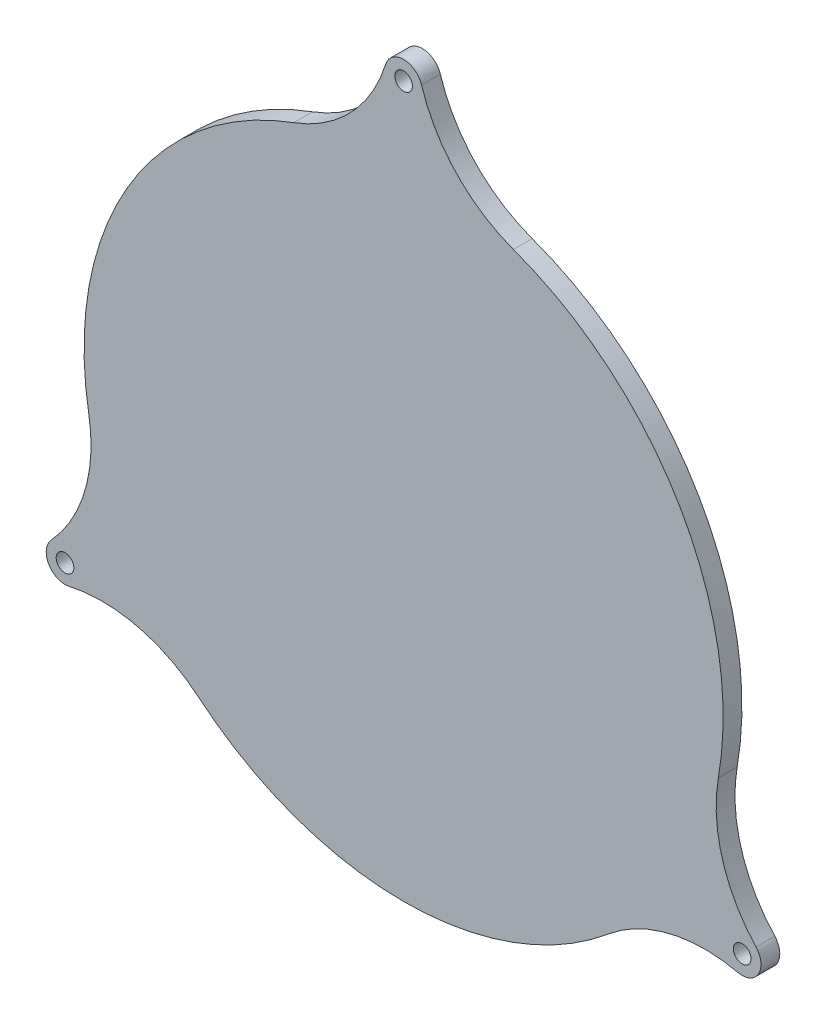
ISO-10303-21;
HEADER;
FILE_DESCRIPTION(('STEP AP214'),'2;1');
FILE_NAME('part.step','',(''),(''),'','','');
FILE_SCHEMA(('AUTOMOTIVE_DESIGN { 1 0 10303 214 1 1 1 1 }'));
ENDSEC;
DATA;
#1=APPLICATION_CONTEXT('core data for automotive mechanical design processes');
#2=APPLICATION_PROTOCOL_DEFINITION('international standard','automotive_design',2000,#1);
#3=PRODUCT_CONTEXT('',#1,'mechanical');
#4=PRODUCT('Part','Part','',(#3));
#5=PRODUCT_RELATED_PRODUCT_CATEGORY('part','',(#4));
#6=PRODUCT_DEFINITION_FORMATION('','',#4);
#7=PRODUCT_DEFINITION_CONTEXT('part definition',#1,'design');
#8=PRODUCT_DEFINITION('design','',#6,#7);
#9=PRODUCT_DEFINITION_SHAPE('','',#8);
#10=(LENGTH_UNIT() NAMED_UNIT(*) SI_UNIT(.MILLI.,.METRE.));
#11=(NAMED_UNIT(*) PLANE_ANGLE_UNIT() SI_UNIT($,.RADIAN.));
#12=(NAMED_UNIT(*) SI_UNIT($,.STERADIAN.) SOLID_ANGLE_UNIT());
#13=UNCERTAINTY_MEASURE_WITH_UNIT(LENGTH_MEASURE(1.E-05),#10,'distance_accuracy_value','');
#14=(GEOMETRIC_REPRESENTATION_CONTEXT(3) GLOBAL_UNCERTAINTY_ASSIGNED_CONTEXT((#13)) GLOBAL_UNIT_ASSIGNED_CONTEXT((#10,
#11,#12)) REPRESENTATION_CONTEXT('',''));
#15=CARTESIAN_POINT('',(0.,0.,0.));
#16=DIRECTION('',(0.,0.,1.));
#17=DIRECTION('',(1.,0.,0.));
#18=AXIS2_PLACEMENT_3D('',#15,#16,#17);
#19=CARTESIAN_POINT('',(21.4816902908379,58.6923076923077,5.));
#20=DIRECTION('',(0.,0.,1.));
#21=DIRECTION('',(1.,0.,0.));
#22=AXIS2_PLACEMENT_3D('',#19,#20,#21);
#23=PLANE('',#22);
#24=CARTESIAN_POINT('',(90.0666419935817,-52.,5.));
#25=DIRECTION('',(0.,0.,1.));
#26=DIRECTION('',(1.,0.,0.));
#27=AXIS2_PLACEMENT_3D('',#24,#25,#26);
#28=CIRCLE('',#27,2.35);
#29=CARTESIAN_POINT('',(92.4166419935816,-52.,5.));
#30=VERTEX_POINT('',#29);
#31=EDGE_CURVE('E287',#30,#30,#28,.T.);
#32=ORIENTED_EDGE('',*,*,#31,.F.);
#33=EDGE_LOOP('',(#32));
#34=FACE_BOUND('',#33,.T.);
#35=CARTESIAN_POINT('',(42.9633805816758,117.384615384615,5.));
#36=DIRECTION('',(0.,0.,-1.));
#37=DIRECTION('',(1.,0.,0.));
#38=AXIS2_PLACEMENT_3D('',#35,#36,#37);
#39=CIRCLE('',#38,40.);
#40=CARTESIAN_POINT('',(29.2150987955395,79.8215384615384,5.));
#41=VERTEX_POINT('',#40);
#42=CARTESIAN_POINT('',(4.77370895351953,105.487179487179,5.));
#43=VERTEX_POINT('',#42);
#44=EDGE_CURVE('E178',#41,#43,#39,.T.);
#45=ORIENTED_EDGE('',*,*,#44,.T.);
#46=CARTESIAN_POINT('',(0.,104.,5.));
#47=DIRECTION('',(0.,0.,1.));
#48=DIRECTION('',(1.,0.,0.));
#49=AXIS2_PLACEMENT_3D('',#46,#47,#48);
#50=CIRCLE('',#49,5.);
#51=CARTESIAN_POINT('',(-4.77370895351953,105.487179487179,5.));
#52=VERTEX_POINT('',#51);
#53=EDGE_CURVE('E106',#43,#52,#50,.T.);
#54=ORIENTED_EDGE('',*,*,#53,.T.);
#55=CARTESIAN_POINT('',(-42.9633805816758,117.384615384615,5.));
#56=DIRECTION('',(0.,0.,-1.));
#57=DIRECTION('',(-1.,0.,0.));
#58=AXIS2_PLACEMENT_3D('',#55,#56,#57);
#59=CIRCLE('',#58,40.);
#60=CARTESIAN_POINT('',(-29.2150987955395,79.8215384615385,5.));
#61=VERTEX_POINT('',#60);
#62=EDGE_CURVE('E205',#52,#61,#59,.T.);
#63=ORIENTED_EDGE('',*,*,#62,.T.);
#64=CARTESIAN_POINT('',(0.,0.,5.));
#65=DIRECTION('',(0.,0.,1.));
#66=DIRECTION('',(1.,0.,0.));
#67=AXIS2_PLACEMENT_3D('',#64,#65,#66);
#68=CIRCLE('',#67,85.);
#69=CARTESIAN_POINT('',(-83.7350294746187,-14.6097514997598,5.));
#70=VERTEX_POINT('',#69);
#71=EDGE_CURVE('E224',#61,#70,#68,.T.);
#72=ORIENTED_EDGE('',*,*,#71,.T.);
#73=CARTESIAN_POINT('',(-123.13974922738,-21.4849286761175,5.));
#74=DIRECTION('',(0.,0.,-1.));
#75=DIRECTION('',(1.,0.,0.));
#76=AXIS2_PLACEMENT_3D('',#73,#74,#75);
#77=CIRCLE('',#76,40.);
#78=CARTESIAN_POINT('',(-93.7414316862259,-48.6094365195686,5.));
#79=VERTEX_POINT('',#78);
#80=EDGE_CURVE('E221',#70,#79,#77,.T.);
#81=ORIENTED_EDGE('',*,*,#80,.T.);
#82=CARTESIAN_POINT('',(-90.0666419935816,-52.,5.));
#83=DIRECTION('',(0.,0.,1.));
#84=DIRECTION('',(1.,0.,0.));
#85=AXIS2_PLACEMENT_3D('',#82,#83,#84);
#86=CIRCLE('',#85,4.99999999999999);
#87=CARTESIAN_POINT('',(-88.9677227327064,-56.8777429676109,5.));
#88=VERTEX_POINT('',#87);
#89=EDGE_CURVE('E223',#79,#88,#86,.T.);
#90=ORIENTED_EDGE('',*,*,#89,.T.);
#91=CARTESIAN_POINT('',(-80.1763686457046,-95.899686708498,5.));
#92=DIRECTION('',(0.,0.,-1.));
#93=DIRECTION('',(-1.,0.,0.));
#94=AXIS2_PLACEMENT_3D('',#91,#92,#93);
#95=CIRCLE('',#94,40.);
#96=CARTESIAN_POINT('',(-54.5199306790791,-65.2117869617787,5.));
#97=VERTEX_POINT('',#96);
#98=EDGE_CURVE('E226',#88,#97,#95,.T.);
#99=ORIENTED_EDGE('',*,*,#98,.T.);
#100=CARTESIAN_POINT('',(0.,0.,5.));
#101=DIRECTION('',(0.,0.,1.));
#102=DIRECTION('',(1.,0.,0.));
#103=AXIS2_PLACEMENT_3D('',#100,#101,#102);
#104=CIRCLE('',#103,85.);
#105=CARTESIAN_POINT('',(54.5199306790791,-65.2117869617787,5.));
#106=VERTEX_POINT('',#105);
#107=EDGE_CURVE('E232',#97,#106,#104,.T.);
#108=ORIENTED_EDGE('',*,*,#107,.T.);
#109=CARTESIAN_POINT('',(80.1763686457047,-95.899686708498,5.));
#110=DIRECTION('',(0.,0.,-1.));
#111=DIRECTION('',(1.,0.,0.));
#112=AXIS2_PLACEMENT_3D('',#109,#110,#111);
#113=CIRCLE('',#112,40.);
#114=CARTESIAN_POINT('',(88.9677227327064,-56.8777429676109,5.));
#115=VERTEX_POINT('',#114);
#116=EDGE_CURVE('E137',#106,#115,#113,.T.);
#117=ORIENTED_EDGE('',*,*,#116,.T.);
#118=CARTESIAN_POINT('',(90.0666419935817,-52.,5.));
#119=DIRECTION('',(0.,0.,1.));
#120=DIRECTION('',(1.,0.,0.));
#121=AXIS2_PLACEMENT_3D('',#118,#119,#120);
#122=CIRCLE('',#121,4.99999999999998);
#123=CARTESIAN_POINT('',(93.7414316862259,-48.6094365195686,5.));
#124=VERTEX_POINT('',#123);
#125=EDGE_CURVE('E131',#115,#124,#122,.T.);
#126=ORIENTED_EDGE('',*,*,#125,.T.);
#127=CARTESIAN_POINT('',(123.13974922738,-21.4849286761174,5.));
#128=DIRECTION('',(0.,0.,-1.));
#129=DIRECTION('',(-1.,0.,0.));
#130=AXIS2_PLACEMENT_3D('',#127,#128,#129);
#131=CIRCLE('',#130,40.);
#132=CARTESIAN_POINT('',(83.7350294746187,-14.6097514997598,5.));
#133=VERTEX_POINT('',#132);
#134=EDGE_CURVE('E135',#124,#133,#131,.T.);
#135=ORIENTED_EDGE('',*,*,#134,.T.);
#136=CARTESIAN_POINT('',(0.,0.,5.));
#137=DIRECTION('',(0.,0.,1.));
#138=DIRECTION('',(1.,0.,0.));
#139=AXIS2_PLACEMENT_3D('',#136,#137,#138);
#140=CIRCLE('',#139,85.);
#141=EDGE_CURVE('E51',#133,#41,#140,.T.);
#142=ORIENTED_EDGE('',*,*,#141,.T.);
#143=EDGE_LOOP('',(#45,#54,#63,#72,#81,#90,#99,#108,#117,#126,#135,#142));
#144=FACE_BOUND('',#143,.T.);
#145=CARTESIAN_POINT('',(0.,104.,5.));
#146=DIRECTION('',(0.,0.,1.));
#147=DIRECTION('',(1.,0.,0.));
#148=AXIS2_PLACEMENT_3D('',#145,#146,#147);
#149=CIRCLE('',#148,2.35);
#150=CARTESIAN_POINT('',(2.35,104.,5.));
#151=VERTEX_POINT('',#150);
#152=EDGE_CURVE('E159',#151,#151,#149,.T.);
#153=ORIENTED_EDGE('',*,*,#152,.F.);
#154=EDGE_LOOP('',(#153));
#155=FACE_BOUND('',#154,.T.);
#156=CARTESIAN_POINT('',(-90.0666419935816,-52.,5.));
#157=DIRECTION('',(0.,0.,1.));
#158=DIRECTION('',(1.,0.,0.));
#159=AXIS2_PLACEMENT_3D('',#156,#157,#158);
#160=CIRCLE('',#159,2.35);
#161=CARTESIAN_POINT('',(-87.7166419935816,-52.,5.));
#162=VERTEX_POINT('',#161);
#163=EDGE_CURVE('E278',#162,#162,#160,.T.);
#164=ORIENTED_EDGE('',*,*,#163,.F.);
#165=EDGE_LOOP('',(#164));
#166=FACE_BOUND('',#165,.T.);
#167=ADVANCED_FACE('F34',(#34,#144,#155,#166),#23,.T.);
#168=CARTESIAN_POINT('',(21.4816902908379,58.6923076923077,0.));
#169=DIRECTION('',(0.,0.,1.));
#170=DIRECTION('',(1.,0.,0.));
#171=AXIS2_PLACEMENT_3D('',#168,#169,#170);
#172=PLANE('',#171);
#173=CARTESIAN_POINT('',(42.9633805816758,117.384615384615,0.));
#174=DIRECTION('',(0.,0.,-1.));
#175=DIRECTION('',(1.,0.,0.));
#176=AXIS2_PLACEMENT_3D('',#173,#174,#175);
#177=CIRCLE('',#176,40.);
#178=CARTESIAN_POINT('',(29.2150987955395,79.8215384615384,0.));
#179=VERTEX_POINT('',#178);
#180=CARTESIAN_POINT('',(4.77370895351953,105.487179487179,0.));
#181=VERTEX_POINT('',#180);
#182=EDGE_CURVE('E155',#179,#181,#177,.T.);
#183=ORIENTED_EDGE('',*,*,#182,.F.);
#184=CARTESIAN_POINT('',(0.,0.,0.));
#185=DIRECTION('',(0.,0.,1.));
#186=DIRECTION('',(1.,0.,0.));
#187=AXIS2_PLACEMENT_3D('',#184,#185,#186);
#188=CIRCLE('',#187,85.);
#189=CARTESIAN_POINT('',(83.7350294746187,-14.6097514997598,0.));
#190=VERTEX_POINT('',#189);
#191=EDGE_CURVE('E98',#190,#179,#188,.T.);
#192=ORIENTED_EDGE('',*,*,#191,.F.);
#193=CARTESIAN_POINT('',(123.13974922738,-21.4849286761174,0.));
#194=DIRECTION('',(0.,0.,-1.));
#195=DIRECTION('',(-1.,0.,0.));
#196=AXIS2_PLACEMENT_3D('',#193,#194,#195);
#197=CIRCLE('',#196,40.);
#198=CARTESIAN_POINT('',(93.7414316862259,-48.6094365195686,0.));
#199=VERTEX_POINT('',#198);
#200=EDGE_CURVE('E92',#199,#190,#197,.T.);
#201=ORIENTED_EDGE('',*,*,#200,.F.);
#202=CARTESIAN_POINT('',(90.0666419935817,-52.,0.));
#203=DIRECTION('',(0.,0.,1.));
#204=DIRECTION('',(1.,0.,0.));
#205=AXIS2_PLACEMENT_3D('',#202,#203,#204);
#206=CIRCLE('',#205,4.99999999999998);
#207=CARTESIAN_POINT('',(88.9677227327064,-56.8777429676109,0.));
#208=VERTEX_POINT('',#207);
#209=EDGE_CURVE('E145',#208,#199,#206,.T.);
#210=ORIENTED_EDGE('',*,*,#209,.F.);
#211=CARTESIAN_POINT('',(80.1763686457047,-95.899686708498,0.));
#212=DIRECTION('',(0.,0.,-1.));
#213=DIRECTION('',(1.,0.,0.));
#214=AXIS2_PLACEMENT_3D('',#211,#212,#213);
#215=CIRCLE('',#214,40.);
#216=CARTESIAN_POINT('',(54.5199306790791,-65.2117869617787,0.));
#217=VERTEX_POINT('',#216);
#218=EDGE_CURVE('E173',#217,#208,#215,.T.);
#219=ORIENTED_EDGE('',*,*,#218,.F.);
#220=CARTESIAN_POINT('',(0.,0.,0.));
#221=DIRECTION('',(0.,0.,1.));
#222=DIRECTION('',(1.,0.,0.));
#223=AXIS2_PLACEMENT_3D('',#220,#221,#222);
#224=CIRCLE('',#223,85.);
#225=CARTESIAN_POINT('',(-54.5199306790791,-65.2117869617787,0.));
#226=VERTEX_POINT('',#225);
#227=EDGE_CURVE('E171',#226,#217,#224,.T.);
#228=ORIENTED_EDGE('',*,*,#227,.F.);
#229=CARTESIAN_POINT('',(-80.1763686457046,-95.899686708498,0.));
#230=DIRECTION('',(0.,0.,-1.));
#231=DIRECTION('',(-1.,0.,0.));
#232=AXIS2_PLACEMENT_3D('',#229,#230,#231);
#233=CIRCLE('',#232,40.);
#234=CARTESIAN_POINT('',(-88.9677227327064,-56.8777429676109,0.));
#235=VERTEX_POINT('',#234);
#236=EDGE_CURVE('E169',#235,#226,#233,.T.);
#237=ORIENTED_EDGE('',*,*,#236,.F.);
#238=CARTESIAN_POINT('',(-90.0666419935816,-52.,0.));
#239=DIRECTION('',(0.,0.,1.));
#240=DIRECTION('',(1.,0.,0.));
#241=AXIS2_PLACEMENT_3D('',#238,#239,#240);
#242=CIRCLE('',#241,4.99999999999999);
#243=CARTESIAN_POINT('',(-93.7414316862259,-48.6094365195686,0.));
#244=VERTEX_POINT('',#243);
#245=EDGE_CURVE('E167',#244,#235,#242,.T.);
#246=ORIENTED_EDGE('',*,*,#245,.F.);
#247=CARTESIAN_POINT('',(-123.13974922738,-21.4849286761175,0.));
#248=DIRECTION('',(0.,0.,-1.));
#249=DIRECTION('',(1.,0.,0.));
#250=AXIS2_PLACEMENT_3D('',#247,#248,#249);
#251=CIRCLE('',#250,40.);
#252=CARTESIAN_POINT('',(-83.7350294746187,-14.6097514997598,0.));
#253=VERTEX_POINT('',#252);
#254=EDGE_CURVE('E165',#253,#244,#251,.T.);
#255=ORIENTED_EDGE('',*,*,#254,.F.);
#256=CARTESIAN_POINT('',(0.,0.,0.));
#257=DIRECTION('',(0.,0.,1.));
#258=DIRECTION('',(1.,0.,0.));
#259=AXIS2_PLACEMENT_3D('',#256,#257,#258);
#260=CIRCLE('',#259,85.);
#261=CARTESIAN_POINT('',(-29.2150987955395,79.8215384615385,0.));
#262=VERTEX_POINT('',#261);
#263=EDGE_CURVE('E163',#262,#253,#260,.T.);
#264=ORIENTED_EDGE('',*,*,#263,.F.);
#265=CARTESIAN_POINT('',(-42.9633805816758,117.384615384615,0.));
#266=DIRECTION('',(0.,0.,-1.));
#267=DIRECTION('',(-1.,0.,0.));
#268=AXIS2_PLACEMENT_3D('',#265,#266,#267);
#269=CIRCLE('',#268,40.);
#270=CARTESIAN_POINT('',(-4.77370895351953,105.487179487179,0.));
#271=VERTEX_POINT('',#270);
#272=EDGE_CURVE('E161',#271,#262,#269,.T.);
#273=ORIENTED_EDGE('',*,*,#272,.F.);
#274=CARTESIAN_POINT('',(0.,104.,0.));
#275=DIRECTION('',(0.,0.,1.));
#276=DIRECTION('',(1.,0.,0.));
#277=AXIS2_PLACEMENT_3D('',#274,#275,#276);
#278=CIRCLE('',#277,5.);
#279=EDGE_CURVE('E158',#181,#271,#278,.T.);
#280=ORIENTED_EDGE('',*,*,#279,.F.);
#281=EDGE_LOOP('',(#183,#192,#201,#210,#219,#228,#237,#246,#255,#264,#273,#280));
#282=FACE_BOUND('',#281,.T.);
#283=CARTESIAN_POINT('',(0.,104.,0.));
#284=DIRECTION('',(0.,0.,1.));
#285=DIRECTION('',(1.,0.,0.));
#286=AXIS2_PLACEMENT_3D('',#283,#284,#285);
#287=CIRCLE('',#286,2.35);
#288=CARTESIAN_POINT('',(2.35,104.,0.));
#289=VERTEX_POINT('',#288);
#290=EDGE_CURVE('E290',#289,#289,#287,.T.);
#291=ORIENTED_EDGE('',*,*,#290,.T.);
#292=EDGE_LOOP('',(#291));
#293=FACE_BOUND('',#292,.T.);
#294=CARTESIAN_POINT('',(90.0666419935817,-52.,0.));
#295=DIRECTION('',(0.,0.,1.));
#296=DIRECTION('',(1.,0.,0.));
#297=AXIS2_PLACEMENT_3D('',#294,#295,#296);
#298=CIRCLE('',#297,2.35);
#299=CARTESIAN_POINT('',(92.4166419935816,-52.,0.));
#300=VERTEX_POINT('',#299);
#301=EDGE_CURVE('E284',#300,#300,#298,.T.);
#302=ORIENTED_EDGE('',*,*,#301,.T.);
#303=EDGE_LOOP('',(#302));
#304=FACE_BOUND('',#303,.T.);
#305=CARTESIAN_POINT('',(-90.0666419935816,-52.,0.));
#306=DIRECTION('',(0.,0.,1.));
#307=DIRECTION('',(1.,0.,0.));
#308=AXIS2_PLACEMENT_3D('',#305,#306,#307);
#309=CIRCLE('',#308,2.35);
#310=CARTESIAN_POINT('',(-87.7166419935816,-52.,0.));
#311=VERTEX_POINT('',#310);
#312=EDGE_CURVE('E281',#311,#311,#309,.T.);
#313=ORIENTED_EDGE('',*,*,#312,.T.);
#314=EDGE_LOOP('',(#313));
#315=FACE_BOUND('',#314,.T.);
#316=ADVANCED_FACE('F209',(#282,#293,#304,#315),#172,.F.);
#317=CARTESIAN_POINT('',(42.9633805816758,117.384615384615,5.));
#318=DIRECTION('',(0.,0.,-1.));
#319=DIRECTION('',(-1.,0.,0.));
#320=AXIS2_PLACEMENT_3D('',#317,#318,#319);
#321=CYLINDRICAL_SURFACE('',#320,40.);
#322=ORIENTED_EDGE('',*,*,#182,.T.);
#323=DIRECTION('',(0.,0.,-1.));
#324=VECTOR('',#323,1.);
#325=CARTESIAN_POINT('',(4.77370895351953,105.487179487179,5.));
#326=LINE('',#325,#324);
#327=EDGE_CURVE('E11',#43,#181,#326,.T.);
#328=ORIENTED_EDGE('',*,*,#327,.F.);
#329=ORIENTED_EDGE('',*,*,#44,.F.);
#330=DIRECTION('',(0.,0.,-1.));
#331=VECTOR('',#330,1.);
#332=CARTESIAN_POINT('',(29.2150987955395,79.8215384615384,5.));
#333=LINE('',#332,#331);
#334=EDGE_CURVE('E151',#41,#179,#333,.T.);
#335=ORIENTED_EDGE('',*,*,#334,.T.);
#336=EDGE_LOOP('',(#322,#328,#329,#335));
#337=FACE_BOUND('',#336,.T.);
#338=ADVANCED_FACE('F36',(#337),#321,.F.);
#339=CARTESIAN_POINT('',(0.,104.,5.));
#340=DIRECTION('',(0.,0.,-1.));
#341=DIRECTION('',(-1.,0.,0.));
#342=AXIS2_PLACEMENT_3D('',#339,#340,#341);
#343=CYLINDRICAL_SURFACE('',#342,5.);
#344=ORIENTED_EDGE('',*,*,#279,.T.);
#345=DIRECTION('',(0.,0.,-1.));
#346=VECTOR('',#345,1.);
#347=CARTESIAN_POINT('',(-4.77370895351953,105.487179487179,5.));
#348=LINE('',#347,#346);
#349=EDGE_CURVE('E43',#52,#271,#348,.T.);
#350=ORIENTED_EDGE('',*,*,#349,.F.);
#351=ORIENTED_EDGE('',*,*,#53,.F.);
#352=ORIENTED_EDGE('',*,*,#327,.T.);
#353=EDGE_LOOP('',(#344,#350,#351,#352));
#354=FACE_BOUND('',#353,.T.);
#355=ADVANCED_FACE('F392',(#354),#343,.T.);
#356=CARTESIAN_POINT('',(-42.9633805816758,117.384615384615,5.));
#357=DIRECTION('',(0.,0.,-1.));
#358=DIRECTION('',(-1.,0.,0.));
#359=AXIS2_PLACEMENT_3D('',#356,#357,#358);
#360=CYLINDRICAL_SURFACE('',#359,40.);
#361=ORIENTED_EDGE('',*,*,#272,.T.);
#362=DIRECTION('',(0.,0.,-1.));
#363=VECTOR('',#362,1.);
#364=CARTESIAN_POINT('',(-29.2150987955395,79.8215384615385,5.));
#365=LINE('',#364,#363);
#366=EDGE_CURVE('E197',#61,#262,#365,.T.);
#367=ORIENTED_EDGE('',*,*,#366,.F.);
#368=ORIENTED_EDGE('',*,*,#62,.F.);
#369=ORIENTED_EDGE('',*,*,#349,.T.);
#370=EDGE_LOOP('',(#361,#367,#368,#369));
#371=FACE_BOUND('',#370,.T.);
#372=ADVANCED_FACE('F203',(#371),#360,.F.);
#373=CARTESIAN_POINT('',(0.,0.,5.));
#374=DIRECTION('',(0.,0.,-1.));
#375=DIRECTION('',(-1.,0.,0.));
#376=AXIS2_PLACEMENT_3D('',#373,#374,#375);
#377=CYLINDRICAL_SURFACE('',#376,85.);
#378=ORIENTED_EDGE('',*,*,#263,.T.);
#379=DIRECTION('',(0.,0.,-1.));
#380=VECTOR('',#379,1.);
#381=CARTESIAN_POINT('',(-83.7350294746187,-14.6097514997598,5.));
#382=LINE('',#381,#380);
#383=EDGE_CURVE('E194',#70,#253,#382,.T.);
#384=ORIENTED_EDGE('',*,*,#383,.F.);
#385=ORIENTED_EDGE('',*,*,#71,.F.);
#386=ORIENTED_EDGE('',*,*,#366,.T.);
#387=EDGE_LOOP('',(#378,#384,#385,#386));
#388=FACE_BOUND('',#387,.T.);
#389=ADVANCED_FACE('F215',(#388),#377,.T.);
#390=CARTESIAN_POINT('',(-123.13974922738,-21.4849286761175,5.));
#391=DIRECTION('',(0.,0.,-1.));
#392=DIRECTION('',(-1.,0.,0.));
#393=AXIS2_PLACEMENT_3D('',#390,#391,#392);
#394=CYLINDRICAL_SURFACE('',#393,40.);
#395=ORIENTED_EDGE('',*,*,#254,.T.);
#396=DIRECTION('',(0.,0.,-1.));
#397=VECTOR('',#396,1.);
#398=CARTESIAN_POINT('',(-93.7414316862259,-48.6094365195686,5.));
#399=LINE('',#398,#397);
#400=EDGE_CURVE('E191',#79,#244,#399,.T.);
#401=ORIENTED_EDGE('',*,*,#400,.F.);
#402=ORIENTED_EDGE('',*,*,#80,.F.);
#403=ORIENTED_EDGE('',*,*,#383,.T.);
#404=EDGE_LOOP('',(#395,#401,#402,#403));
#405=FACE_BOUND('',#404,.T.);
#406=ADVANCED_FACE('F219',(#405),#394,.F.);
#407=CARTESIAN_POINT('',(-90.0666419935816,-52.,5.));
#408=DIRECTION('',(0.,0.,-1.));
#409=DIRECTION('',(-1.,0.,0.));
#410=AXIS2_PLACEMENT_3D('',#407,#408,#409);
#411=CYLINDRICAL_SURFACE('',#410,4.99999999999999);
#412=ORIENTED_EDGE('',*,*,#245,.T.);
#413=DIRECTION('',(0.,0.,-1.));
#414=VECTOR('',#413,1.);
#415=CARTESIAN_POINT('',(-88.9677227327064,-56.8777429676109,5.));
#416=LINE('',#415,#414);
#417=EDGE_CURVE('E188',#88,#235,#416,.T.);
#418=ORIENTED_EDGE('',*,*,#417,.F.);
#419=ORIENTED_EDGE('',*,*,#89,.F.);
#420=ORIENTED_EDGE('',*,*,#400,.T.);
#421=EDGE_LOOP('',(#412,#418,#419,#420));
#422=FACE_BOUND('',#421,.T.);
#423=ADVANCED_FACE('F357',(#422),#411,.T.);
#424=CARTESIAN_POINT('',(-80.1763686457046,-95.899686708498,5.));
#425=DIRECTION('',(0.,0.,-1.));
#426=DIRECTION('',(-1.,0.,0.));
#427=AXIS2_PLACEMENT_3D('',#424,#425,#426);
#428=CYLINDRICAL_SURFACE('',#427,40.);
#429=ORIENTED_EDGE('',*,*,#236,.T.);
#430=DIRECTION('',(0.,0.,-1.));
#431=VECTOR('',#430,1.);
#432=CARTESIAN_POINT('',(-54.5199306790791,-65.2117869617787,5.));
#433=LINE('',#432,#431);
#434=EDGE_CURVE('E185',#97,#226,#433,.T.);
#435=ORIENTED_EDGE('',*,*,#434,.F.);
#436=ORIENTED_EDGE('',*,*,#98,.F.);
#437=ORIENTED_EDGE('',*,*,#417,.T.);
#438=EDGE_LOOP('',(#429,#435,#436,#437));
#439=FACE_BOUND('',#438,.T.);
#440=ADVANCED_FACE('F348',(#439),#428,.F.);
#441=CARTESIAN_POINT('',(0.,0.,5.));
#442=DIRECTION('',(0.,0.,-1.));
#443=DIRECTION('',(-1.,0.,0.));
#444=AXIS2_PLACEMENT_3D('',#441,#442,#443);
#445=CYLINDRICAL_SURFACE('',#444,85.);
#446=ORIENTED_EDGE('',*,*,#227,.T.);
#447=DIRECTION('',(0.,0.,-1.));
#448=VECTOR('',#447,1.);
#449=CARTESIAN_POINT('',(54.5199306790791,-65.2117869617787,5.));
#450=LINE('',#449,#448);
#451=EDGE_CURVE('E182',#106,#217,#450,.T.);
#452=ORIENTED_EDGE('',*,*,#451,.F.);
#453=ORIENTED_EDGE('',*,*,#107,.F.);
#454=ORIENTED_EDGE('',*,*,#434,.T.);
#455=EDGE_LOOP('',(#446,#452,#453,#454));
#456=FACE_BOUND('',#455,.T.);
#457=ADVANCED_FACE('F238',(#456),#445,.T.);
#458=CARTESIAN_POINT('',(80.1763686457047,-95.899686708498,5.));
#459=DIRECTION('',(0.,0.,-1.));
#460=DIRECTION('',(-1.,0.,0.));
#461=AXIS2_PLACEMENT_3D('',#458,#459,#460);
#462=CYLINDRICAL_SURFACE('',#461,40.);
#463=ORIENTED_EDGE('',*,*,#218,.T.);
#464=DIRECTION('',(0.,0.,-1.));
#465=VECTOR('',#464,1.);
#466=CARTESIAN_POINT('',(88.9677227327064,-56.8777429676109,5.));
#467=LINE('',#466,#465);
#468=EDGE_CURVE('E146',#115,#208,#467,.T.);
#469=ORIENTED_EDGE('',*,*,#468,.F.);
#470=ORIENTED_EDGE('',*,*,#116,.F.);
#471=ORIENTED_EDGE('',*,*,#451,.T.);
#472=EDGE_LOOP('',(#463,#469,#470,#471));
#473=FACE_BOUND('',#472,.T.);
#474=ADVANCED_FACE('F242',(#473),#462,.F.);
#475=CARTESIAN_POINT('',(90.0666419935817,-52.,5.));
#476=DIRECTION('',(0.,0.,-1.));
#477=DIRECTION('',(-1.,0.,0.));
#478=AXIS2_PLACEMENT_3D('',#475,#476,#477);
#479=CYLINDRICAL_SURFACE('',#478,4.99999999999998);
#480=ORIENTED_EDGE('',*,*,#209,.T.);
#481=DIRECTION('',(0.,0.,-1.));
#482=VECTOR('',#481,1.);
#483=CARTESIAN_POINT('',(93.7414316862259,-48.6094365195686,5.));
#484=LINE('',#483,#482);
#485=EDGE_CURVE('E142',#124,#199,#484,.T.);
#486=ORIENTED_EDGE('',*,*,#485,.F.);
#487=ORIENTED_EDGE('',*,*,#125,.F.);
#488=ORIENTED_EDGE('',*,*,#468,.T.);
#489=EDGE_LOOP('',(#480,#486,#487,#488));
#490=FACE_BOUND('',#489,.T.);
#491=ADVANCED_FACE('F143',(#490),#479,.T.);
#492=CARTESIAN_POINT('',(123.13974922738,-21.4849286761174,5.));
#493=DIRECTION('',(0.,0.,-1.));
#494=DIRECTION('',(-1.,0.,0.));
#495=AXIS2_PLACEMENT_3D('',#492,#493,#494);
#496=CYLINDRICAL_SURFACE('',#495,40.);
#497=ORIENTED_EDGE('',*,*,#200,.T.);
#498=DIRECTION('',(0.,0.,-1.));
#499=VECTOR('',#498,1.);
#500=CARTESIAN_POINT('',(83.7350294746187,-14.6097514997598,5.));
#501=LINE('',#500,#499);
#502=EDGE_CURVE('E147',#133,#190,#501,.T.);
#503=ORIENTED_EDGE('',*,*,#502,.F.);
#504=ORIENTED_EDGE('',*,*,#134,.F.);
#505=ORIENTED_EDGE('',*,*,#485,.T.);
#506=EDGE_LOOP('',(#497,#503,#504,#505));
#507=FACE_BOUND('',#506,.T.);
#508=ADVANCED_FACE('F149',(#507),#496,.F.);
#509=CARTESIAN_POINT('',(0.,0.,5.));
#510=DIRECTION('',(0.,0.,-1.));
#511=DIRECTION('',(-1.,0.,0.));
#512=AXIS2_PLACEMENT_3D('',#509,#510,#511);
#513=CYLINDRICAL_SURFACE('',#512,85.);
#514=ORIENTED_EDGE('',*,*,#191,.T.);
#515=ORIENTED_EDGE('',*,*,#334,.F.);
#516=ORIENTED_EDGE('',*,*,#141,.F.);
#517=ORIENTED_EDGE('',*,*,#502,.T.);
#518=EDGE_LOOP('',(#514,#515,#516,#517));
#519=FACE_BOUND('',#518,.T.);
#520=ADVANCED_FACE('F246',(#519),#513,.T.);
#521=CARTESIAN_POINT('',(0.,104.,5.));
#522=DIRECTION('',(0.,0.,-1.));
#523=DIRECTION('',(-1.,0.,0.));
#524=AXIS2_PLACEMENT_3D('',#521,#522,#523);
#525=CYLINDRICAL_SURFACE('',#524,2.35);
#526=ORIENTED_EDGE('',*,*,#152,.T.);
#527=EDGE_LOOP('',(#526));
#528=FACE_BOUND('',#527,.T.);
#529=ORIENTED_EDGE('',*,*,#290,.F.);
#530=EDGE_LOOP('',(#529));
#531=FACE_BOUND('',#530,.T.);
#532=ADVANCED_FACE('F248',(#528,#531),#525,.F.);
#533=CARTESIAN_POINT('',(90.0666419935817,-52.,5.));
#534=DIRECTION('',(0.,0.,-1.));
#535=DIRECTION('',(-1.,0.,0.));
#536=AXIS2_PLACEMENT_3D('',#533,#534,#535);
#537=CYLINDRICAL_SURFACE('',#536,2.35);
#538=ORIENTED_EDGE('',*,*,#31,.T.);
#539=EDGE_LOOP('',(#538));
#540=FACE_BOUND('',#539,.T.);
#541=ORIENTED_EDGE('',*,*,#301,.F.);
#542=EDGE_LOOP('',(#541));
#543=FACE_BOUND('',#542,.T.);
#544=ADVANCED_FACE('F254',(#540,#543),#537,.F.);
#545=CARTESIAN_POINT('',(-90.0666419935816,-52.,5.));
#546=DIRECTION('',(0.,0.,-1.));
#547=DIRECTION('',(-1.,0.,0.));
#548=AXIS2_PLACEMENT_3D('',#545,#546,#547);
#549=CYLINDRICAL_SURFACE('',#548,2.35);
#550=ORIENTED_EDGE('',*,*,#163,.T.);
#551=EDGE_LOOP('',(#550));
#552=FACE_BOUND('',#551,.T.);
#553=ORIENTED_EDGE('',*,*,#312,.F.);
#554=EDGE_LOOP('',(#553));
#555=FACE_BOUND('',#554,.T.);
#556=ADVANCED_FACE('F269',(#552,#555),#549,.F.);
#557=CLOSED_SHELL('',(#167,#316,#338,#355,#372,#389,#406,#423,#440,#457,#474,#491,#508,#520,
#532,#544,#556));
#558=MANIFOLD_SOLID_BREP('B2',#557);
#559=ADVANCED_BREP_SHAPE_REPRESENTATION('',(#18,#558),#14);
#560=SHAPE_DEFINITION_REPRESENTATION(#9,#559);
ENDSEC;
END-ISO-10303-21;
